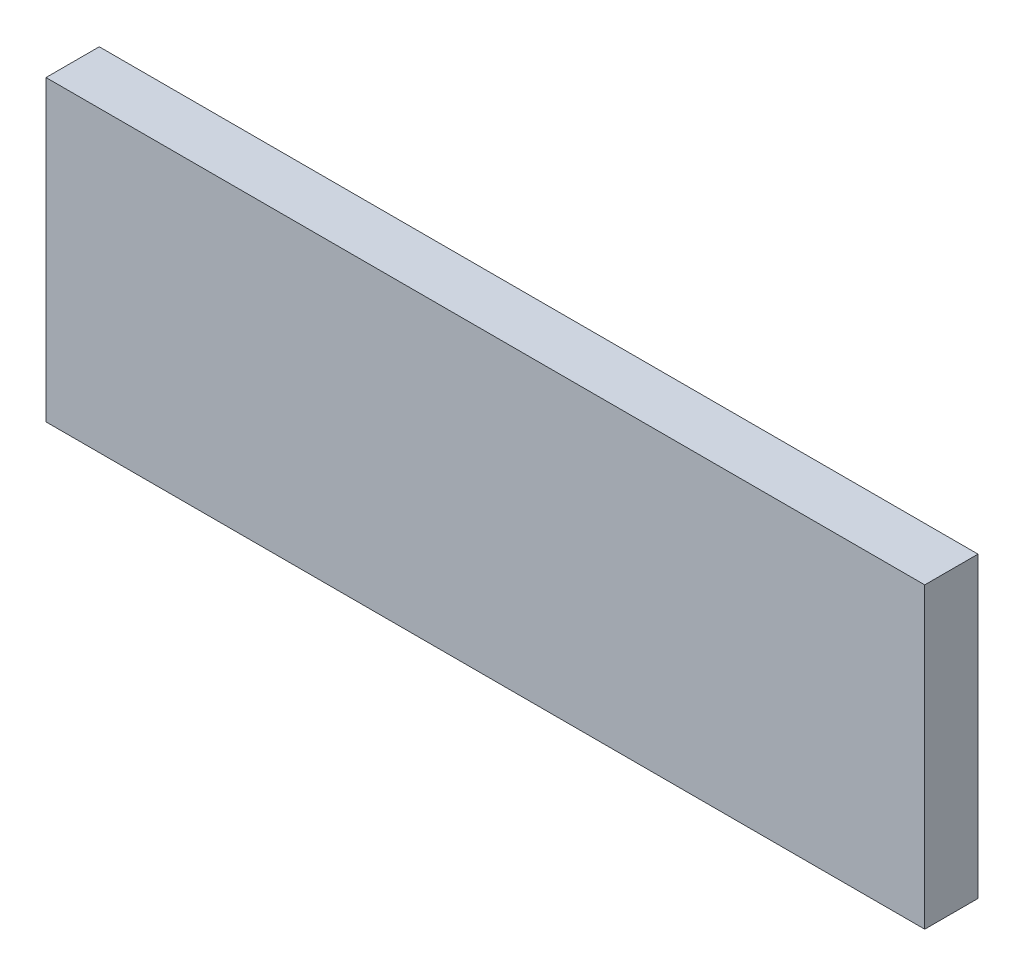
ISO-10303-21;
HEADER;
FILE_DESCRIPTION(('STEP AP214'),'2;1');
FILE_NAME('part.step','',(''),(''),'','','');
FILE_SCHEMA(('AUTOMOTIVE_DESIGN { 1 0 10303 214 1 1 1 1 }'));
ENDSEC;
DATA;
#1=APPLICATION_CONTEXT('core data for automotive mechanical design processes');
#2=APPLICATION_PROTOCOL_DEFINITION('international standard','automotive_design',2000,#1);
#3=PRODUCT_CONTEXT('',#1,'mechanical');
#4=PRODUCT('Part','Part','',(#3));
#5=PRODUCT_RELATED_PRODUCT_CATEGORY('part','',(#4));
#6=PRODUCT_DEFINITION_FORMATION('','',#4);
#7=PRODUCT_DEFINITION_CONTEXT('part definition',#1,'design');
#8=PRODUCT_DEFINITION('design','',#6,#7);
#9=PRODUCT_DEFINITION_SHAPE('','',#8);
#10=(LENGTH_UNIT() NAMED_UNIT(*) SI_UNIT(.MILLI.,.METRE.));
#11=(NAMED_UNIT(*) PLANE_ANGLE_UNIT() SI_UNIT($,.RADIAN.));
#12=(NAMED_UNIT(*) SI_UNIT($,.STERADIAN.) SOLID_ANGLE_UNIT());
#13=UNCERTAINTY_MEASURE_WITH_UNIT(LENGTH_MEASURE(1.E-05),#10,'distance_accuracy_value','');
#14=(GEOMETRIC_REPRESENTATION_CONTEXT(3) GLOBAL_UNCERTAINTY_ASSIGNED_CONTEXT((#13)) GLOBAL_UNIT_ASSIGNED_CONTEXT((#10,
#11,#12)) REPRESENTATION_CONTEXT('',''));
#15=CARTESIAN_POINT('',(0.,0.,0.));
#16=DIRECTION('',(0.,0.,1.));
#17=DIRECTION('',(1.,0.,0.));
#18=AXIS2_PLACEMENT_3D('',#15,#16,#17);
#19=CARTESIAN_POINT('',(0.,-28.,10.));
#20=DIRECTION('',(0.,1.,0.));
#21=DIRECTION('',(0.,0.,1.));
#22=AXIS2_PLACEMENT_3D('',#19,#20,#21);
#23=PLANE('',#22);
#24=DIRECTION('',(1.,0.,0.));
#25=VECTOR('',#24,1.);
#26=CARTESIAN_POINT('',(0.,-28.,0.));
#27=LINE('',#26,#25);
#28=CARTESIAN_POINT('',(-82.5,-28.,0.));
#29=VERTEX_POINT('',#28);
#30=CARTESIAN_POINT('',(82.5,-28.,0.));
#31=VERTEX_POINT('',#30);
#32=EDGE_CURVE('E101',#29,#31,#27,.T.);
#33=ORIENTED_EDGE('',*,*,#32,.T.);
#34=DIRECTION('',(0.,0.,-1.));
#35=VECTOR('',#34,1.);
#36=CARTESIAN_POINT('',(82.5,-28.,10.));
#37=LINE('',#36,#35);
#38=CARTESIAN_POINT('',(82.5,-28.,10.));
#39=VERTEX_POINT('',#38);
#40=EDGE_CURVE('E11',#39,#31,#37,.T.);
#41=ORIENTED_EDGE('',*,*,#40,.F.);
#42=DIRECTION('',(1.,0.,0.));
#43=VECTOR('',#42,1.);
#44=CARTESIAN_POINT('',(0.,-28.,10.));
#45=LINE('',#44,#43);
#46=CARTESIAN_POINT('',(-82.5,-28.,10.));
#47=VERTEX_POINT('',#46);
#48=EDGE_CURVE('E87',#47,#39,#45,.T.);
#49=ORIENTED_EDGE('',*,*,#48,.F.);
#50=DIRECTION('',(0.,0.,-1.));
#51=VECTOR('',#50,1.);
#52=CARTESIAN_POINT('',(-82.5,-28.,10.));
#53=LINE('',#52,#51);
#54=EDGE_CURVE('E54',#47,#29,#53,.T.);
#55=ORIENTED_EDGE('',*,*,#54,.T.);
#56=EDGE_LOOP('',(#33,#41,#49,#55));
#57=FACE_BOUND('',#56,.T.);
#58=ADVANCED_FACE('F38',(#57),#23,.F.);
#59=CARTESIAN_POINT('',(82.5,0.,10.));
#60=DIRECTION('',(-1.,0.,0.));
#61=DIRECTION('',(0.,0.,1.));
#62=AXIS2_PLACEMENT_3D('',#59,#60,#61);
#63=PLANE('',#62);
#64=DIRECTION('',(0.,1.,0.));
#65=VECTOR('',#64,1.);
#66=CARTESIAN_POINT('',(82.5,0.,0.));
#67=LINE('',#66,#65);
#68=CARTESIAN_POINT('',(82.5,28.,0.));
#69=VERTEX_POINT('',#68);
#70=EDGE_CURVE('E92',#31,#69,#67,.T.);
#71=ORIENTED_EDGE('',*,*,#70,.T.);
#72=DIRECTION('',(0.,0.,-1.));
#73=VECTOR('',#72,1.);
#74=CARTESIAN_POINT('',(82.5,28.,10.));
#75=LINE('',#74,#73);
#76=CARTESIAN_POINT('',(82.5,28.,10.));
#77=VERTEX_POINT('',#76);
#78=EDGE_CURVE('E46',#77,#69,#75,.T.);
#79=ORIENTED_EDGE('',*,*,#78,.F.);
#80=DIRECTION('',(0.,1.,0.));
#81=VECTOR('',#80,1.);
#82=CARTESIAN_POINT('',(82.5,0.,10.));
#83=LINE('',#82,#81);
#84=EDGE_CURVE('E79',#39,#77,#83,.T.);
#85=ORIENTED_EDGE('',*,*,#84,.F.);
#86=ORIENTED_EDGE('',*,*,#40,.T.);
#87=EDGE_LOOP('',(#71,#79,#85,#86));
#88=FACE_BOUND('',#87,.T.);
#89=ADVANCED_FACE('F91',(#88),#63,.F.);
#90=CARTESIAN_POINT('',(0.,28.,10.));
#91=DIRECTION('',(0.,1.,0.));
#92=DIRECTION('',(0.,0.,1.));
#93=AXIS2_PLACEMENT_3D('',#90,#91,#92);
#94=PLANE('',#93);
#95=DIRECTION('',(1.,0.,0.));
#96=VECTOR('',#95,1.);
#97=CARTESIAN_POINT('',(0.,28.,0.));
#98=LINE('',#97,#96);
#99=CARTESIAN_POINT('',(-82.5,28.,0.));
#100=VERTEX_POINT('',#99);
#101=EDGE_CURVE('E104',#100,#69,#98,.T.);
#102=ORIENTED_EDGE('',*,*,#101,.F.);
#103=DIRECTION('',(0.,0.,-1.));
#104=VECTOR('',#103,1.);
#105=CARTESIAN_POINT('',(-82.5,28.,10.));
#106=LINE('',#105,#104);
#107=CARTESIAN_POINT('',(-82.5,28.,10.));
#108=VERTEX_POINT('',#107);
#109=EDGE_CURVE('E68',#108,#100,#106,.T.);
#110=ORIENTED_EDGE('',*,*,#109,.F.);
#111=DIRECTION('',(1.,0.,0.));
#112=VECTOR('',#111,1.);
#113=CARTESIAN_POINT('',(0.,28.,10.));
#114=LINE('',#113,#112);
#115=EDGE_CURVE('E86',#108,#77,#114,.T.);
#116=ORIENTED_EDGE('',*,*,#115,.T.);
#117=ORIENTED_EDGE('',*,*,#78,.T.);
#118=EDGE_LOOP('',(#102,#110,#116,#117));
#119=FACE_BOUND('',#118,.T.);
#120=ADVANCED_FACE('F95',(#119),#94,.T.);
#121=CARTESIAN_POINT('',(-82.5,0.,10.));
#122=DIRECTION('',(-1.,0.,0.));
#123=DIRECTION('',(0.,0.,1.));
#124=AXIS2_PLACEMENT_3D('',#121,#122,#123);
#125=PLANE('',#124);
#126=DIRECTION('',(0.,1.,0.));
#127=VECTOR('',#126,1.);
#128=CARTESIAN_POINT('',(-82.5,0.,0.));
#129=LINE('',#128,#127);
#130=EDGE_CURVE('E106',#29,#100,#129,.T.);
#131=ORIENTED_EDGE('',*,*,#130,.F.);
#132=ORIENTED_EDGE('',*,*,#54,.F.);
#133=DIRECTION('',(0.,1.,0.));
#134=VECTOR('',#133,1.);
#135=CARTESIAN_POINT('',(-82.5,0.,10.));
#136=LINE('',#135,#134);
#137=EDGE_CURVE('E96',#47,#108,#136,.T.);
#138=ORIENTED_EDGE('',*,*,#137,.T.);
#139=ORIENTED_EDGE('',*,*,#109,.T.);
#140=EDGE_LOOP('',(#131,#132,#138,#139));
#141=FACE_BOUND('',#140,.T.);
#142=ADVANCED_FACE('F112',(#141),#125,.T.);
#143=CARTESIAN_POINT('',(0.,0.,10.));
#144=DIRECTION('',(0.,0.,1.));
#145=DIRECTION('',(1.,0.,0.));
#146=AXIS2_PLACEMENT_3D('',#143,#144,#145);
#147=PLANE('',#146);
#148=ORIENTED_EDGE('',*,*,#48,.T.);
#149=ORIENTED_EDGE('',*,*,#84,.T.);
#150=ORIENTED_EDGE('',*,*,#115,.F.);
#151=ORIENTED_EDGE('',*,*,#137,.F.);
#152=EDGE_LOOP('',(#148,#149,#150,#151));
#153=FACE_BOUND('',#152,.T.);
#154=ADVANCED_FACE('F83',(#153),#147,.T.);
#155=CARTESIAN_POINT('',(0.,0.,0.));
#156=DIRECTION('',(0.,0.,1.));
#157=DIRECTION('',(1.,0.,0.));
#158=AXIS2_PLACEMENT_3D('',#155,#156,#157);
#159=PLANE('',#158);
#160=ORIENTED_EDGE('',*,*,#32,.F.);
#161=ORIENTED_EDGE('',*,*,#130,.T.);
#162=ORIENTED_EDGE('',*,*,#101,.T.);
#163=ORIENTED_EDGE('',*,*,#70,.F.);
#164=EDGE_LOOP('',(#160,#161,#162,#163));
#165=FACE_BOUND('',#164,.T.);
#166=ADVANCED_FACE('F111',(#165),#159,.F.);
#167=CLOSED_SHELL('',(#58,#89,#120,#142,#154,#166));
#168=MANIFOLD_SOLID_BREP('B2',#167);
#169=ADVANCED_BREP_SHAPE_REPRESENTATION('',(#18,#168),#14);
#170=SHAPE_DEFINITION_REPRESENTATION(#9,#169);
ENDSEC;
END-ISO-10303-21;
